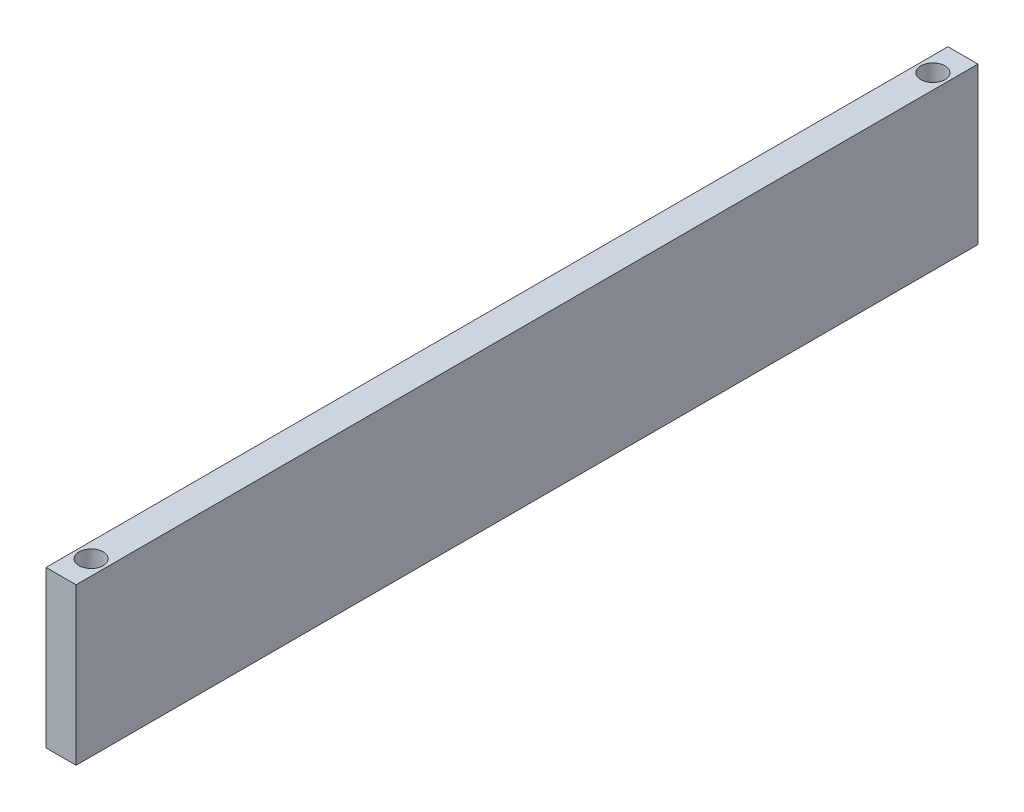
ISO-10303-21;
HEADER;
FILE_DESCRIPTION(('STEP AP214'),'2;1');
FILE_NAME('part.step','',(''),(''),'','','');
FILE_SCHEMA(('AUTOMOTIVE_DESIGN { 1 0 10303 214 1 1 1 1 }'));
ENDSEC;
DATA;
#1=APPLICATION_CONTEXT('core data for automotive mechanical design processes');
#2=APPLICATION_PROTOCOL_DEFINITION('international standard','automotive_design',2000,#1);
#3=PRODUCT_CONTEXT('',#1,'mechanical');
#4=PRODUCT('Part','Part','',(#3));
#5=PRODUCT_RELATED_PRODUCT_CATEGORY('part','',(#4));
#6=PRODUCT_DEFINITION_FORMATION('','',#4);
#7=PRODUCT_DEFINITION_CONTEXT('part definition',#1,'design');
#8=PRODUCT_DEFINITION('design','',#6,#7);
#9=PRODUCT_DEFINITION_SHAPE('','',#8);
#10=(LENGTH_UNIT() NAMED_UNIT(*) SI_UNIT(.MILLI.,.METRE.));
#11=(NAMED_UNIT(*) PLANE_ANGLE_UNIT() SI_UNIT($,.RADIAN.));
#12=(NAMED_UNIT(*) SI_UNIT($,.STERADIAN.) SOLID_ANGLE_UNIT());
#13=UNCERTAINTY_MEASURE_WITH_UNIT(LENGTH_MEASURE(1.E-05),#10,'distance_accuracy_value','');
#14=(GEOMETRIC_REPRESENTATION_CONTEXT(3) GLOBAL_UNCERTAINTY_ASSIGNED_CONTEXT((#13)) GLOBAL_UNIT_ASSIGNED_CONTEXT((#10,
#11,#12)) REPRESENTATION_CONTEXT('',''));
#15=CARTESIAN_POINT('',(0.,0.,0.));
#16=DIRECTION('',(0.,0.,1.));
#17=DIRECTION('',(1.,0.,0.));
#18=AXIS2_PLACEMENT_3D('',#15,#16,#17);
#19=CARTESIAN_POINT('',(-6.35,0.,-190.5));
#20=DIRECTION('',(0.,-1.,0.));
#21=DIRECTION('',(0.,0.,-1.));
#22=AXIS2_PLACEMENT_3D('',#19,#20,#21);
#23=PLANE('',#22);
#24=CARTESIAN_POINT('',(-3.175,0.,-6.35));
#25=DIRECTION('',(0.,1.,0.));
#26=DIRECTION('',(0.,0.,1.));
#27=AXIS2_PLACEMENT_3D('',#24,#25,#26);
#28=CIRCLE('',#27,2.54);
#29=CARTESIAN_POINT('',(-3.175,0.,-3.81));
#30=VERTEX_POINT('',#29);
#31=EDGE_CURVE('E112',#30,#30,#28,.T.);
#32=ORIENTED_EDGE('',*,*,#31,.T.);
#33=EDGE_LOOP('',(#32));
#34=FACE_BOUND('',#33,.T.);
#35=CARTESIAN_POINT('',(-3.175,0.,-184.15));
#36=DIRECTION('',(0.,1.,0.));
#37=DIRECTION('',(0.,0.,1.));
#38=AXIS2_PLACEMENT_3D('',#35,#36,#37);
#39=CIRCLE('',#38,2.54000000000001);
#40=CARTESIAN_POINT('',(-3.175,0.,-181.61));
#41=VERTEX_POINT('',#40);
#42=EDGE_CURVE('E158',#41,#41,#39,.T.);
#43=ORIENTED_EDGE('',*,*,#42,.T.);
#44=EDGE_LOOP('',(#43));
#45=FACE_BOUND('',#44,.T.);
#46=DIRECTION('',(1.,0.,0.));
#47=VECTOR('',#46,1.);
#48=CARTESIAN_POINT('',(-6.35,0.,0.));
#49=LINE('',#48,#47);
#50=CARTESIAN_POINT('',(-6.35,0.,0.));
#51=VERTEX_POINT('',#50);
#52=CARTESIAN_POINT('',(0.,0.,0.));
#53=VERTEX_POINT('',#52);
#54=EDGE_CURVE('E108',#51,#53,#49,.T.);
#55=ORIENTED_EDGE('',*,*,#54,.F.);
#56=DIRECTION('',(0.,0.,1.));
#57=VECTOR('',#56,1.);
#58=CARTESIAN_POINT('',(-6.35,0.,-190.5));
#59=LINE('',#58,#57);
#60=CARTESIAN_POINT('',(-6.35,0.,-190.5));
#61=VERTEX_POINT('',#60);
#62=EDGE_CURVE('E11',#61,#51,#59,.T.);
#63=ORIENTED_EDGE('',*,*,#62,.F.);
#64=DIRECTION('',(1.,0.,0.));
#65=VECTOR('',#64,1.);
#66=CARTESIAN_POINT('',(-6.35,0.,-190.5));
#67=LINE('',#66,#65);
#68=CARTESIAN_POINT('',(0.,0.,-190.5));
#69=VERTEX_POINT('',#68);
#70=EDGE_CURVE('E101',#61,#69,#67,.T.);
#71=ORIENTED_EDGE('',*,*,#70,.T.);
#72=DIRECTION('',(0.,0.,1.));
#73=VECTOR('',#72,1.);
#74=CARTESIAN_POINT('',(0.,0.,-190.5));
#75=LINE('',#74,#73);
#76=EDGE_CURVE('E46',#69,#53,#75,.T.);
#77=ORIENTED_EDGE('',*,*,#76,.T.);
#78=EDGE_LOOP('',(#55,#63,#71,#77));
#79=FACE_BOUND('',#78,.T.);
#80=ADVANCED_FACE('F43',(#34,#45,#79),#23,.T.);
#81=CARTESIAN_POINT('',(-6.35,0.,-190.5));
#82=DIRECTION('',(-1.,0.,0.));
#83=DIRECTION('',(0.,0.,1.));
#84=AXIS2_PLACEMENT_3D('',#81,#82,#83);
#85=PLANE('',#84);
#86=DIRECTION('',(0.,-1.,0.));
#87=VECTOR('',#86,1.);
#88=CARTESIAN_POINT('',(-6.35,0.,0.));
#89=LINE('',#88,#87);
#90=CARTESIAN_POINT('',(-6.35,33.02,0.));
#91=VERTEX_POINT('',#90);
#92=EDGE_CURVE('E103',#91,#51,#89,.T.);
#93=ORIENTED_EDGE('',*,*,#92,.F.);
#94=DIRECTION('',(0.,0.,1.));
#95=VECTOR('',#94,1.);
#96=CARTESIAN_POINT('',(-6.35,33.02,-190.5));
#97=LINE('',#96,#95);
#98=CARTESIAN_POINT('',(-6.35,33.02,-190.5));
#99=VERTEX_POINT('',#98);
#100=EDGE_CURVE('E52',#99,#91,#97,.T.);
#101=ORIENTED_EDGE('',*,*,#100,.F.);
#102=DIRECTION('',(0.,-1.,0.));
#103=VECTOR('',#102,1.);
#104=CARTESIAN_POINT('',(-6.35,0.,-190.5));
#105=LINE('',#104,#103);
#106=EDGE_CURVE('E98',#99,#61,#105,.T.);
#107=ORIENTED_EDGE('',*,*,#106,.T.);
#108=ORIENTED_EDGE('',*,*,#62,.T.);
#109=EDGE_LOOP('',(#93,#101,#107,#108));
#110=FACE_BOUND('',#109,.T.);
#111=ADVANCED_FACE('F119',(#110),#85,.T.);
#112=CARTESIAN_POINT('',(-6.35,33.02,-190.5));
#113=DIRECTION('',(0.,1.,0.));
#114=DIRECTION('',(0.,0.,1.));
#115=AXIS2_PLACEMENT_3D('',#112,#113,#114);
#116=PLANE('',#115);
#117=CARTESIAN_POINT('',(-3.175,33.02,-6.35));
#118=DIRECTION('',(0.,1.,0.));
#119=DIRECTION('',(0.,0.,1.));
#120=AXIS2_PLACEMENT_3D('',#117,#118,#119);
#121=CIRCLE('',#120,2.54);
#122=CARTESIAN_POINT('',(-3.175,33.02,-3.81));
#123=VERTEX_POINT('',#122);
#124=EDGE_CURVE('E153',#123,#123,#121,.T.);
#125=ORIENTED_EDGE('',*,*,#124,.F.);
#126=EDGE_LOOP('',(#125));
#127=FACE_BOUND('',#126,.T.);
#128=CARTESIAN_POINT('',(-3.175,33.02,-184.15));
#129=DIRECTION('',(0.,1.,0.));
#130=DIRECTION('',(0.,0.,1.));
#131=AXIS2_PLACEMENT_3D('',#128,#129,#130);
#132=CIRCLE('',#131,2.54000000000001);
#133=CARTESIAN_POINT('',(-3.175,33.02,-181.61));
#134=VERTEX_POINT('',#133);
#135=EDGE_CURVE('E154',#134,#134,#132,.T.);
#136=ORIENTED_EDGE('',*,*,#135,.F.);
#137=EDGE_LOOP('',(#136));
#138=FACE_BOUND('',#137,.T.);
#139=DIRECTION('',(-1.,0.,0.));
#140=VECTOR('',#139,1.);
#141=CARTESIAN_POINT('',(-6.35,33.02,0.));
#142=LINE('',#141,#140);
#143=CARTESIAN_POINT('',(0.,33.02,0.));
#144=VERTEX_POINT('',#143);
#145=EDGE_CURVE('E93',#144,#91,#142,.T.);
#146=ORIENTED_EDGE('',*,*,#145,.F.);
#147=DIRECTION('',(0.,0.,1.));
#148=VECTOR('',#147,1.);
#149=CARTESIAN_POINT('',(0.,33.02,-190.5));
#150=LINE('',#149,#148);
#151=CARTESIAN_POINT('',(0.,33.02,-190.5));
#152=VERTEX_POINT('',#151);
#153=EDGE_CURVE('E88',#152,#144,#150,.T.);
#154=ORIENTED_EDGE('',*,*,#153,.F.);
#155=DIRECTION('',(-1.,0.,0.));
#156=VECTOR('',#155,1.);
#157=CARTESIAN_POINT('',(-6.35,33.02,-190.5));
#158=LINE('',#157,#156);
#159=EDGE_CURVE('E91',#152,#99,#158,.T.);
#160=ORIENTED_EDGE('',*,*,#159,.T.);
#161=ORIENTED_EDGE('',*,*,#100,.T.);
#162=EDGE_LOOP('',(#146,#154,#160,#161));
#163=FACE_BOUND('',#162,.T.);
#164=ADVANCED_FACE('F90',(#127,#138,#163),#116,.T.);
#165=CARTESIAN_POINT('',(0.,33.02,-190.5));
#166=DIRECTION('',(1.,0.,0.));
#167=DIRECTION('',(0.,1.,0.));
#168=AXIS2_PLACEMENT_3D('',#165,#166,#167);
#169=PLANE('',#168);
#170=DIRECTION('',(0.,1.,0.));
#171=VECTOR('',#170,1.);
#172=CARTESIAN_POINT('',(0.,33.02,0.));
#173=LINE('',#172,#171);
#174=EDGE_CURVE('E111',#53,#144,#173,.T.);
#175=ORIENTED_EDGE('',*,*,#174,.F.);
#176=ORIENTED_EDGE('',*,*,#76,.F.);
#177=DIRECTION('',(0.,1.,0.));
#178=VECTOR('',#177,1.);
#179=CARTESIAN_POINT('',(0.,33.02,-190.5));
#180=LINE('',#179,#178);
#181=EDGE_CURVE('E97',#69,#152,#180,.T.);
#182=ORIENTED_EDGE('',*,*,#181,.T.);
#183=ORIENTED_EDGE('',*,*,#153,.T.);
#184=EDGE_LOOP('',(#175,#176,#182,#183));
#185=FACE_BOUND('',#184,.T.);
#186=ADVANCED_FACE('F100',(#185),#169,.T.);
#187=CARTESIAN_POINT('',(0.,0.,-190.5));
#188=DIRECTION('',(0.,0.,-1.));
#189=DIRECTION('',(-1.,0.,0.));
#190=AXIS2_PLACEMENT_3D('',#187,#188,#189);
#191=PLANE('',#190);
#192=ORIENTED_EDGE('',*,*,#70,.F.);
#193=ORIENTED_EDGE('',*,*,#106,.F.);
#194=ORIENTED_EDGE('',*,*,#159,.F.);
#195=ORIENTED_EDGE('',*,*,#181,.F.);
#196=EDGE_LOOP('',(#192,#193,#194,#195));
#197=FACE_BOUND('',#196,.T.);
#198=ADVANCED_FACE('F96',(#197),#191,.T.);
#199=CARTESIAN_POINT('',(0.,0.,0.));
#200=DIRECTION('',(0.,0.,-1.));
#201=DIRECTION('',(-1.,0.,0.));
#202=AXIS2_PLACEMENT_3D('',#199,#200,#201);
#203=PLANE('',#202);
#204=ORIENTED_EDGE('',*,*,#54,.T.);
#205=ORIENTED_EDGE('',*,*,#174,.T.);
#206=ORIENTED_EDGE('',*,*,#145,.T.);
#207=ORIENTED_EDGE('',*,*,#92,.T.);
#208=EDGE_LOOP('',(#204,#205,#206,#207));
#209=FACE_BOUND('',#208,.T.);
#210=ADVANCED_FACE('F118',(#209),#203,.F.);
#211=CARTESIAN_POINT('',(-3.175,0.,-184.15));
#212=DIRECTION('',(0.,1.,0.));
#213=DIRECTION('',(0.,0.,1.));
#214=AXIS2_PLACEMENT_3D('',#211,#212,#213);
#215=CYLINDRICAL_SURFACE('',#214,2.54000000000001);
#216=ORIENTED_EDGE('',*,*,#42,.F.);
#217=EDGE_LOOP('',(#216));
#218=FACE_BOUND('',#217,.T.);
#219=ORIENTED_EDGE('',*,*,#135,.T.);
#220=EDGE_LOOP('',(#219));
#221=FACE_BOUND('',#220,.T.);
#222=ADVANCED_FACE('F138',(#218,#221),#215,.F.);
#223=CARTESIAN_POINT('',(-3.175,0.,-6.35));
#224=DIRECTION('',(0.,1.,0.));
#225=DIRECTION('',(0.,0.,1.));
#226=AXIS2_PLACEMENT_3D('',#223,#224,#225);
#227=CYLINDRICAL_SURFACE('',#226,2.54);
#228=ORIENTED_EDGE('',*,*,#31,.F.);
#229=EDGE_LOOP('',(#228));
#230=FACE_BOUND('',#229,.T.);
#231=ORIENTED_EDGE('',*,*,#124,.T.);
#232=EDGE_LOOP('',(#231));
#233=FACE_BOUND('',#232,.T.);
#234=ADVANCED_FACE('F142',(#230,#233),#227,.F.);
#235=CLOSED_SHELL('',(#80,#111,#164,#186,#198,#210,#222,#234));
#236=MANIFOLD_SOLID_BREP('B2',#235);
#237=ADVANCED_BREP_SHAPE_REPRESENTATION('',(#18,#236),#14);
#238=SHAPE_DEFINITION_REPRESENTATION(#9,#237);
ENDSEC;
END-ISO-10303-21;
